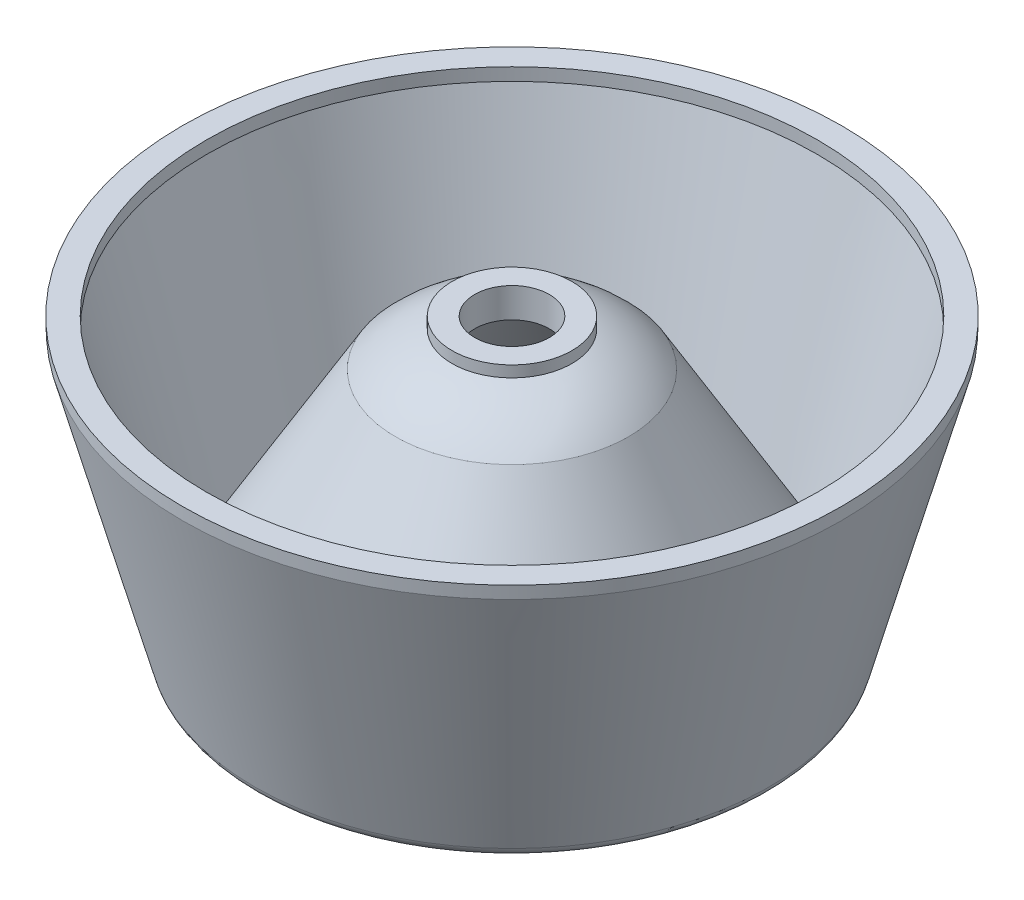
ISO-10303-21;
HEADER;
FILE_DESCRIPTION(('STEP AP214'),'2;1');
FILE_NAME('part.step','',(''),(''),'','','');
FILE_SCHEMA(('AUTOMOTIVE_DESIGN { 1 0 10303 214 1 1 1 1 }'));
ENDSEC;
DATA;
#1=APPLICATION_CONTEXT('core data for automotive mechanical design processes');
#2=APPLICATION_PROTOCOL_DEFINITION('international standard','automotive_design',2000,#1);
#3=PRODUCT_CONTEXT('',#1,'mechanical');
#4=PRODUCT('Part','Part','',(#3));
#5=PRODUCT_RELATED_PRODUCT_CATEGORY('part','',(#4));
#6=PRODUCT_DEFINITION_FORMATION('','',#4);
#7=PRODUCT_DEFINITION_CONTEXT('part definition',#1,'design');
#8=PRODUCT_DEFINITION('design','',#6,#7);
#9=PRODUCT_DEFINITION_SHAPE('','',#8);
#10=(LENGTH_UNIT() NAMED_UNIT(*) SI_UNIT(.MILLI.,.METRE.));
#11=(NAMED_UNIT(*) PLANE_ANGLE_UNIT() SI_UNIT($,.RADIAN.));
#12=(NAMED_UNIT(*) SI_UNIT($,.STERADIAN.) SOLID_ANGLE_UNIT());
#13=UNCERTAINTY_MEASURE_WITH_UNIT(LENGTH_MEASURE(1.E-05),#10,'distance_accuracy_value','');
#14=(GEOMETRIC_REPRESENTATION_CONTEXT(3) GLOBAL_UNCERTAINTY_ASSIGNED_CONTEXT((#13)) GLOBAL_UNIT_ASSIGNED_CONTEXT((#10,
#11,#12)) REPRESENTATION_CONTEXT('',''));
#15=CARTESIAN_POINT('',(0.,0.,0.));
#16=DIRECTION('',(0.,0.,1.));
#17=DIRECTION('',(1.,0.,0.));
#18=AXIS2_PLACEMENT_3D('',#15,#16,#17);
#19=CARTESIAN_POINT('',(0.,37.5,0.));
#20=DIRECTION('',(0.,1.,0.));
#21=DIRECTION('',(-0.00319420156689542,0.,0.999994898525163));
#22=AXIS2_PLACEMENT_3D('',#19,#20,#21);
#23=PLANE('',#22);
#24=CARTESIAN_POINT('',(0.,37.5,0.));
#25=DIRECTION('',(0.,1.,0.));
#26=DIRECTION('',(0.,0.,1.));
#27=AXIS2_PLACEMENT_3D('',#24,#25,#26);
#28=CIRCLE('',#27,71.2513108531376);
#29=CARTESIAN_POINT('',(0.,37.5,71.2513108531377));
#30=VERTEX_POINT('',#29);
#31=EDGE_CURVE('E37',#30,#30,#28,.T.);
#32=ORIENTED_EDGE('',*,*,#31,.T.);
#33=EDGE_LOOP('',(#32));
#34=FACE_BOUND('',#33,.T.);
#35=CARTESIAN_POINT('',(0.,37.5000000000001,0.));
#36=DIRECTION('',(0.,-1.,0.));
#37=DIRECTION('',(0.,0.,-1.));
#38=AXIS2_PLACEMENT_3D('',#35,#36,#37);
#39=CIRCLE('',#38,65.9862345365824);
#40=CARTESIAN_POINT('',(0.,37.5000000000001,-65.9862345365824));
#41=VERTEX_POINT('',#40);
#42=EDGE_CURVE('E220',#41,#41,#39,.T.);
#43=ORIENTED_EDGE('',*,*,#42,.T.);
#44=EDGE_LOOP('',(#43));
#45=FACE_BOUND('',#44,.T.);
#46=ADVANCED_FACE('F34',(#34,#45),#23,.T.);
#47=CARTESIAN_POINT('',(0.,37.5,0.));
#48=DIRECTION('',(0.,1.,0.));
#49=DIRECTION('',(0.,0.,1.));
#50=AXIS2_PLACEMENT_3D('',#47,#48,#49);
#51=CIRCLE('',#50,8.07840908288413);
#52=CARTESIAN_POINT('',(0.,37.5,8.07840908288415));
#53=VERTEX_POINT('',#52);
#54=EDGE_CURVE('E124',#53,#53,#51,.T.);
#55=ORIENTED_EDGE('',*,*,#54,.F.);
#56=EDGE_LOOP('',(#55));
#57=FACE_BOUND('',#56,.T.);
#58=CARTESIAN_POINT('',(0.,37.5,0.));
#59=DIRECTION('',(0.,-1.,0.));
#60=DIRECTION('',(0.,0.,-1.));
#61=AXIS2_PLACEMENT_3D('',#58,#59,#60);
#62=CIRCLE('',#61,12.9537179563936);
#63=CARTESIAN_POINT('',(0.,37.5000000000001,-12.9537179563936));
#64=VERTEX_POINT('',#63);
#65=EDGE_CURVE('E218',#64,#64,#62,.T.);
#66=ORIENTED_EDGE('',*,*,#65,.F.);
#67=EDGE_LOOP('',(#66));
#68=FACE_BOUND('',#67,.T.);
#69=ADVANCED_FACE('F212',(#57,#68),#23,.T.);
#70=CARTESIAN_POINT('',(0.,34.7675604909933,0.));
#71=DIRECTION('',(0.,1.,0.));
#72=DIRECTION('',(0.,0.,1.));
#73=AXIS2_PLACEMENT_3D('',#70,#71,#72);
#74=CONICAL_SURFACE('',#73,71.1662591192297,0.0311166199937539);
#75=ORIENTED_EDGE('',*,*,#31,.F.);
#76=EDGE_LOOP('',(#75));
#77=FACE_BOUND('',#76,.T.);
#78=CARTESIAN_POINT('',(0.,34.7675604909933,0.));
#79=DIRECTION('',(0.,1.,0.));
#80=DIRECTION('',(0.,0.,1.));
#81=AXIS2_PLACEMENT_3D('',#78,#79,#80);
#82=CIRCLE('',#81,71.1662591192297);
#83=CARTESIAN_POINT('',(0.,34.7675604909932,71.1662591192298));
#84=VERTEX_POINT('',#83);
#85=EDGE_CURVE('E166',#84,#84,#82,.T.);
#86=ORIENTED_EDGE('',*,*,#85,.T.);
#87=EDGE_LOOP('',(#86));
#88=FACE_BOUND('',#87,.T.);
#89=ADVANCED_FACE('F215',(#77,#88),#74,.T.);
#90=CARTESIAN_POINT('',(0.,-22.8783157825729,0.));
#91=DIRECTION('',(0.,1.,0.));
#92=DIRECTION('',(0.,0.,1.));
#93=AXIS2_PLACEMENT_3D('',#90,#91,#92);
#94=CONICAL_SURFACE('',#93,55.5585716287928,0.264411817054796);
#95=ORIENTED_EDGE('',*,*,#85,.F.);
#96=EDGE_LOOP('',(#95));
#97=FACE_BOUND('',#96,.T.);
#98=CARTESIAN_POINT('',(0.,-22.8783157825729,0.));
#99=DIRECTION('',(0.,1.,0.));
#100=DIRECTION('',(0.,0.,1.));
#101=AXIS2_PLACEMENT_3D('',#98,#99,#100);
#102=CIRCLE('',#101,55.5585716287928);
#103=CARTESIAN_POINT('',(0.,-22.878315782573,55.5585716287928));
#104=VERTEX_POINT('',#103);
#105=EDGE_CURVE('E169',#104,#104,#102,.T.);
#106=ORIENTED_EDGE('',*,*,#105,.T.);
#107=EDGE_LOOP('',(#106));
#108=FACE_BOUND('',#107,.T.);
#109=ADVANCED_FACE('F315',(#97,#108),#94,.T.);
#110=CARTESIAN_POINT('',(0.,-22.0942910667897,0.));
#111=DIRECTION('',(0.,1.,0.));
#112=DIRECTION('',(0.,0.,1.));
#113=AXIS2_PLACEMENT_3D('',#110,#111,#112);
#114=TOROIDAL_SURFACE('',#113,52.6628324753052,3.00000000000001);
#115=ORIENTED_EDGE('',*,*,#105,.F.);
#116=EDGE_LOOP('',(#115));
#117=FACE_BOUND('',#116,.T.);
#118=CARTESIAN_POINT('',(0.,-23.6066026757682,0.));
#119=DIRECTION('',(0.,1.,0.));
#120=DIRECTION('',(0.,0.,1.));
#121=AXIS2_PLACEMENT_3D('',#118,#119,#120);
#122=CIRCLE('',#121,50.0719033760536);
#123=CARTESIAN_POINT('',(0.,-23.6066026757683,50.0719033760536));
#124=VERTEX_POINT('',#123);
#125=EDGE_CURVE('E172',#124,#124,#122,.T.);
#126=ORIENTED_EDGE('',*,*,#125,.T.);
#127=EDGE_LOOP('',(#126));
#128=FACE_BOUND('',#127,.T.);
#129=ADVANCED_FACE('F318',(#117,#128),#114,.T.);
#130=CARTESIAN_POINT('',(0.,19.7175239632816,0.));
#131=DIRECTION('',(0.,-1.,0.));
#132=DIRECTION('',(0.,0.,-1.));
#133=AXIS2_PLACEMENT_3D('',#130,#131,#132);
#134=CONICAL_SURFACE('',#133,24.7838398454789,0.52834403413605);
#135=CARTESIAN_POINT('',(0.,-8.16513837251757,-13.9887140210881));
#136=DIRECTION('',(0.,0.863643033083877,-0.5041038696595));
#137=DIRECTION('',(0.,-0.5041038696595,-0.863643033083877));
#138=AXIS2_PLACEMENT_3D('',#135,#136,#137);
#139=ELLIPSE('',#138,47.5414040016155,38.6023461770421);
#140=CARTESIAN_POINT('',(7.5,15.3439843225376,26.2876878308013));
#141=VERTEX_POINT('',#140);
#142=CARTESIAN_POINT('',(-7.5,15.3439843225376,26.2876878308013));
#143=VERTEX_POINT('',#142);
#144=EDGE_CURVE('E128',#141,#143,#139,.F.);
#145=ORIENTED_EDGE('',*,*,#144,.T.);
#146=CARTESIAN_POINT('',(-7.50000000000001,40.0566706355563,10.5104434704213));
#147=CARTESIAN_POINT('',(-7.50000000000001,39.7655766617726,10.7191566056887));
#148=CARTESIAN_POINT('',(-7.50000000000001,39.4735114007291,10.9265084335069));
#149=CARTESIAN_POINT('',(-7.50000000000001,38.8876987082595,11.3388117295738));
#150=CARTESIAN_POINT('',(-7.50000000000001,38.59395130737,11.5437632411923));
#151=CARTESIAN_POINT('',(-7.50000000000001,38.0050451635706,11.9515811630868));
#152=CARTESIAN_POINT('',(-7.50000000000001,37.7098865226982,12.1544477208692));
#153=CARTESIAN_POINT('',(-7.50000000000001,37.1183277239239,12.5583646793533));
#154=CARTESIAN_POINT('',(-7.50000000000001,36.8219275595669,12.7594150705947));
#155=CARTESIAN_POINT('',(-7.50000000000001,35.9312357854119,13.3600966382183));
#156=CARTESIAN_POINT('',(-7.50000000000001,35.3353336650756,13.757340490684));
#157=CARTESIAN_POINT('',(-7.50000000000001,34.1402138530294,14.5468259516208));
#158=CARTESIAN_POINT('',(-7.50000000000001,33.5409960904165,14.9390674525221));
#159=CARTESIAN_POINT('',(-7.50000000000001,32.3401383714061,15.7193974090499));
#160=CARTESIAN_POINT('',(-7.50000000000001,31.7384992553008,16.1074871588101));
#161=CARTESIAN_POINT('',(-7.50000000000001,30.5331218234223,16.8803797945363));
#162=CARTESIAN_POINT('',(-7.50000000000001,29.9293835236649,17.2651827055023));
#163=CARTESIAN_POINT('',(-7.50000000000001,28.7201472535547,18.0320972410571));
#164=CARTESIAN_POINT('',(-7.50000000000001,28.1146491739927,18.414208693353));
#165=CARTESIAN_POINT('',(-7.50000000000001,26.902222535717,19.1761561061038));
#166=CARTESIAN_POINT('',(-7.5,26.2952939748241,19.555992063089));
#167=CARTESIAN_POINT('',(-7.5,24.5143235361577,20.6666823350602));
#168=CARTESIAN_POINT('',(-7.5,23.3386520881877,21.3949236650343));
#169=CARTESIAN_POINT('',(-7.5,20.9840560634099,22.8461263809627));
#170=CARTESIAN_POINT('',(-7.5,19.8051314790932,23.5690877547157));
#171=CARTESIAN_POINT('',(-7.5,17.4448371506546,25.0109565797027));
#172=CARTESIAN_POINT('',(-7.5,16.263467452458,25.72986410615));
#173=CARTESIAN_POINT('',(-7.5,13.8988137658005,27.1645240306566));
#174=CARTESIAN_POINT('',(-7.5,12.7155297760589,27.8802764266039));
#175=CARTESIAN_POINT('',(-7.5,10.3471016894525,29.309475992974));
#176=CARTESIAN_POINT('',(-7.5,9.16195715185793,30.0229224328013));
#177=CARTESIAN_POINT('',(-7.5,6.79044297474455,31.4477761399253));
#178=CARTESIAN_POINT('',(-7.5,5.60407333498858,32.1591834068271));
#179=CARTESIAN_POINT('',(-7.5,2.0434695314973,34.2909171250113));
#180=CARTESIAN_POINT('',(-7.5,-0.332255618588415,35.7087531452764));
#181=CARTESIAN_POINT('',(-7.5,-4.51280405870445,38.1981999125627));
#182=CARTESIAN_POINT('',(-7.5,-6.31704351647453,39.2707919899745));
#183=CARTESIAN_POINT('',(-7.5,-9.92677175904228,41.4138724336156));
#184=CARTESIAN_POINT('',(-7.5,-11.7322605440315,42.4843607995223));
#185=CARTESIAN_POINT('',(-7.49999999999999,-17.1501973576237,45.6933403044326));
#186=CARTESIAN_POINT('',(-7.49999999999999,-20.7641169781774,47.8293465246936));
#187=CARTESIAN_POINT('',(-7.49999999999999,-27.992542682349,52.0957954534047));
#188=CARTESIAN_POINT('',(-7.49999999999999,-31.6070473362345,54.226240585441));
#189=CARTESIAN_POINT('',(-7.49999999999999,-37.0301646797427,57.4195904501202));
#190=CARTESIAN_POINT('',(-7.49999999999999,-38.8380956388334,58.4836531890051));
#191=CARTESIAN_POINT('',(-7.49999999999999,-42.4543475322118,60.6111153497434));
#192=CARTESIAN_POINT('',(-7.49999999999999,-44.2626684664567,61.6745147716696));
#193=CARTESIAN_POINT('',(-7.49999999999999,-46.0711523317887,62.7376369936534));
#194=B_SPLINE_CURVE_WITH_KNOTS('',3,(#146,#147,#148,#149,#150,#151,#152,#153,#154,#155,#156,
#157,#158,#159,#160,#161,#162,#163,#164,#165,#166,#167,#168,#169,#170,#171,#172,#173,#174,#175,
#176,#177,#178,#179,#180,#181,#182,#183,#184,#185,#186,#187,#188,#189,#190,#191,#192,#193),
.UNSPECIFIED.,.F.,.F.,(4,2,2,2,2,2,2,2,2,2,2,2,2,2,2,2,2,2,2,2,2,2,2,4),(0.,1.07454705731892,
2.14907466928079,3.22352572980844,4.29798238376902,6.44646112025147,8.59498597962802,
10.742820378726,12.8906384267249,15.038592739387,17.1865503263568,21.3353657569929,
25.4841907718652,29.6329385562692,33.7816891174998,37.931645691019,42.0816030679257,
50.3815314737758,56.6784822099514,62.9754339115513,75.5693333588582,88.1562676949951,
94.4497240815708,100.743179777603),.UNSPECIFIED.);
#195=CARTESIAN_POINT('',(-7.49999999999999,-19.0050952532553,46.7887340507071));
#196=VERTEX_POINT('',#195);
#197=EDGE_CURVE('E130',#143,#196,#194,.T.);
#198=ORIENTED_EDGE('',*,*,#197,.T.);
#199=CARTESIAN_POINT('',(0.,-60.5626749685241,-24.4087241579802));
#200=DIRECTION('',(0.,-0.863643033083877,0.5041038696595));
#201=DIRECTION('',(0.,-0.5041038696595,-0.863643033083877));
#202=AXIS2_PLACEMENT_3D('',#199,#200,#201);
#203=ELLIPSE('',#202,82.9543741196778,67.3567290221141);
#204=CARTESIAN_POINT('',(7.50000000000001,-19.0050952532553,46.7887340507071));
#205=VERTEX_POINT('',#204);
#206=EDGE_CURVE('E241',#196,#205,#203,.F.);
#207=ORIENTED_EDGE('',*,*,#206,.T.);
#208=CARTESIAN_POINT('',(7.50000000000001,-46.0711523317887,62.7376369936534));
#209=CARTESIAN_POINT('',(7.50000000000001,-44.2620113029933,61.6741298239998));
#210=CARTESIAN_POINT('',(7.50000000000001,-42.4530342657251,60.6103437552531));
#211=CARTESIAN_POINT('',(7.50000000000001,-38.8354708611624,58.4821080073729));
#212=CARTESIAN_POINT('',(7.50000000000001,-37.0268844938271,57.4176583283088));
#213=CARTESIAN_POINT('',(7.50000000000001,-31.6019252125617,54.2232256923123));
#214=CARTESIAN_POINT('',(7.50000000000001,-27.9862317052162,52.0920883698607));
#215=CARTESIAN_POINT('',(7.50000000000001,-22.5648930292407,48.8922134072252));
#216=CARTESIAN_POINT('',(7.50000000000001,-20.7582697625525,47.8251328777192));
#217=CARTESIAN_POINT('',(7.50000000000001,-17.1458254569408,45.6896168905014));
#218=CARTESIAN_POINT('',(7.50000000000001,-15.3400044175686,44.6211814335487));
#219=CARTESIAN_POINT('',(7.50000000000001,-11.7292928290917,42.4826062046166));
#220=CARTESIAN_POINT('',(7.50000000000001,-9.92440231194013,41.4124663786801));
#221=CARTESIAN_POINT('',(7.50000000000001,-6.3158611622351,39.2700893541151));
#222=CARTESIAN_POINT('',(7.50000000000001,-4.51221053227013,38.1978521511258));
#223=CARTESIAN_POINT('',(7.50000000000001,-0.906040023102871,36.050426498997));
#224=CARTESIAN_POINT('',(7.50000000000001,0.896479447619462,34.9752373636693));
#225=CARTESIAN_POINT('',(7.5,4.49941358845735,32.8213667414914));
#226=CARTESIAN_POINT('',(7.5,6.29982827364613,31.7426852798622));
#227=CARTESIAN_POINT('',(7.5,9.8976891942927,29.5807315782929));
#228=CARTESIAN_POINT('',(7.5,11.6951356738487,28.4974597449621));
#229=CARTESIAN_POINT('',(7.5,14.3883672498062,26.8676417882717));
#230=CARTESIAN_POINT('',(7.5,15.2856335449511,26.3235433691663));
#231=CARTESIAN_POINT('',(7.5,17.0789713496087,25.2333814830119));
#232=CARTESIAN_POINT('',(7.5,17.9750428597733,24.6873180170357));
#233=CARTESIAN_POINT('',(7.5,19.7660023984773,23.5926535709363));
#234=CARTESIAN_POINT('',(7.5,20.6608899941274,23.0440518823064));
#235=CARTESIAN_POINT('',(7.5,22.4488699139707,21.9439364086733));
#236=CARTESIAN_POINT('',(7.5,23.3419622446605,21.3924226342341));
#237=CARTESIAN_POINT('',(7.5,25.1258297464349,20.285808015422));
#238=CARTESIAN_POINT('',(7.5,26.016605087581,19.7307074453642));
#239=CARTESIAN_POINT('',(7.5,27.795288484753,18.6158990550499));
#240=CARTESIAN_POINT('',(7.5,28.6831965008359,18.0561911709938));
#241=CARTESIAN_POINT('',(7.5,30.4555314362659,16.9306226833111));
#242=CARTESIAN_POINT('',(7.5,31.33995706911,16.3647600520551));
#243=CARTESIAN_POINT('',(7.5,33.1036763533669,15.2251422342821));
#244=CARTESIAN_POINT('',(7.5,33.9829702011514,14.651387352626));
#245=CARTESIAN_POINT('',(7.5,35.2966186009912,13.7824960382977));
#246=CARTESIAN_POINT('',(7.5,35.7336779198482,13.4914492964155));
#247=CARTESIAN_POINT('',(7.5,36.6055990008639,12.9060905921452));
#248=CARTESIAN_POINT('',(7.5,37.0404607891853,12.6117786687647));
#249=CARTESIAN_POINT('',(7.5,37.9075626120638,12.0191912261694));
#250=CARTESIAN_POINT('',(7.5,38.3398023017798,11.720915201404));
#251=CARTESIAN_POINT('',(7.5,38.9856609777691,11.2699019736658));
#252=CARTESIAN_POINT('',(7.5,39.200534848863,11.1189611802883));
#253=CARTESIAN_POINT('',(7.5,39.6293385556098,10.8157409204059));
#254=CARTESIAN_POINT('',(7.5,39.8432683830072,10.6634614422292));
#255=CARTESIAN_POINT('',(7.5,40.0566706355563,10.5104434704213));
#256=B_SPLINE_CURVE_WITH_KNOTS('',3,(#208,#209,#210,#211,#212,#213,#214,#215,#216,#217,#218,
#219,#220,#221,#222,#223,#224,#225,#226,#227,#228,#229,#230,#231,#232,#233,#234,#235,#236,#237,
#238,#239,#240,#241,#242,#243,#244,#245,#246,#247,#248,#249,#250,#251,#252,#253,#254,#255),
.UNSPECIFIED.,.F.,.F.,(4,2,2,2,2,2,2,2,2,2,2,2,2,2,2,2,2,2,2,2,2,2,2,4),(0.,6.29574041454673,
12.5914801697312,25.1825406724665,31.4772154715609,37.7718867459695,44.0667614241697,
50.361649204559,56.6581509382567,62.9546073004991,69.2505171268053,72.3985572757143,
75.5465957062368,78.695573419449,81.8445397169775,84.9932679692361,88.1420398969513,
91.2918826290948,94.4416040292237,96.0168896445208,97.5921564608361,99.1676261399107,
99.9553938409752,100.74316841733),.UNSPECIFIED.);
#257=EDGE_CURVE('E233',#205,#141,#256,.T.);
#258=ORIENTED_EDGE('',*,*,#257,.T.);
#259=EDGE_LOOP('',(#145,#198,#207,#258));
#260=FACE_BOUND('',#259,.T.);
#261=CARTESIAN_POINT('',(0.,-8.16513837251757,13.9887140210881));
#262=DIRECTION('',(0.,0.863643033083876,0.504103869659501));
#263=DIRECTION('',(0.,-0.504103869659501,0.863643033083876));
#264=AXIS2_PLACEMENT_3D('',#261,#262,#263);
#265=ELLIPSE('',#264,47.5414040016155,38.6023461770421);
#266=CARTESIAN_POINT('',(-7.5,15.3439843225377,-26.2876878308013));
#267=VERTEX_POINT('',#266);
#268=CARTESIAN_POINT('',(7.5,15.3439843225377,-26.2876878308013));
#269=VERTEX_POINT('',#268);
#270=EDGE_CURVE('E164',#267,#269,#265,.F.);
#271=ORIENTED_EDGE('',*,*,#270,.T.);
#272=CARTESIAN_POINT('',(7.50000000000001,36.514463840228,-12.9667677122093));
#273=CARTESIAN_POINT('',(7.50000000000001,36.1701854115528,-13.198901376583));
#274=CARTESIAN_POINT('',(7.50000000000001,35.8251964352769,-13.4299779040882));
#275=CARTESIAN_POINT('',(7.50000000000001,35.1339751513132,-13.8902585615131));
#276=CARTESIAN_POINT('',(7.50000000000001,34.7877428531498,-14.1194627057325));
#277=CARTESIAN_POINT('',(7.50000000000001,34.0942182220762,-14.5762368999491));
#278=CARTESIAN_POINT('',(7.50000000000001,33.7469259225215,-14.8038070006255));
#279=CARTESIAN_POINT('',(7.50000000000001,33.0514045646832,-15.2575121997333));
#280=CARTESIAN_POINT('',(7.50000000000001,32.7031755043447,-15.4836472950131));
#281=CARTESIAN_POINT('',(7.50000000000001,31.6573252546498,-16.1601137124399));
#282=CARTESIAN_POINT('',(7.50000000000001,30.9584769111223,-16.6085482799637));
#283=CARTESIAN_POINT('',(7.50000000000001,29.5582172162175,-17.5014064550555));
#284=CARTESIAN_POINT('',(7.50000000000001,28.8568058408429,-17.9458300249329));
#285=CARTESIAN_POINT('',(7.50000000000001,27.4520438873103,-18.8313598126875));
#286=CARTESIAN_POINT('',(7.50000000000001,26.7486936239612,-19.2724665302136));
#287=CARTESIAN_POINT('',(7.50000000000001,25.3403289125306,-20.1520081673602));
#288=CARTESIAN_POINT('',(7.5,24.6353144699725,-20.5904430958309));
#289=CARTESIAN_POINT('',(7.5,22.518182884786,-21.9024677529962));
#290=CARTESIAN_POINT('',(7.5,21.1040175138028,-22.7727521993502));
#291=CARTESIAN_POINT('',(7.5,18.2994851794771,-24.4901360841103));
#292=CARTESIAN_POINT('',(7.5,16.9091922262672,-25.3373565869008));
#293=CARTESIAN_POINT('',(7.5,14.125875901698,-27.0273026378815));
#294=CARTESIAN_POINT('',(7.5,12.7328525269276,-27.8700281804514));
#295=CARTESIAN_POINT('',(7.5,9.94474519185435,-29.5520379571466));
#296=CARTESIAN_POINT('',(7.5,8.5496612471456,-30.3913222171355));
#297=CARTESIAN_POINT('',(7.5,5.75788137206262,-32.067202767667));
#298=CARTESIAN_POINT('',(7.5,4.36118544260092,-32.9037990597301));
#299=CARTESIAN_POINT('',(7.5,1.56631369309104,-34.5749704591231));
#300=CARTESIAN_POINT('',(7.5,0.168137689748779,-35.409545259833));
#301=CARTESIAN_POINT('',(7.5,-2.62925020397156,-37.0769571869354));
#302=CARTESIAN_POINT('',(7.5,-4.02846209454389,-37.909794313002));
#303=CARTESIAN_POINT('',(7.5,-8.22736173783412,-40.4061837000011));
#304=CARTESIAN_POINT('',(7.5,-11.0283116927821,-42.0676129129488));
#305=CARTESIAN_POINT('',(7.49999999999999,-15.9457011629111,-44.9797675222702));
#306=CARTESIAN_POINT('',(7.49999999999999,-18.0616386828266,-46.231341136563));
#307=CARTESIAN_POINT('',(7.49999999999999,-22.2945639314905,-48.7327090004408));
#308=CARTESIAN_POINT('',(7.49999999999999,-24.4115516597721,-49.9825032508159));
#309=CARTESIAN_POINT('',(7.49999999999999,-30.7637568187319,-53.729783340092));
#310=CARTESIAN_POINT('',(7.49999999999999,-35.0002149675831,-56.2251657739972));
#311=CARTESIAN_POINT('',(7.49999999999999,-43.4741539065799,-61.2115294601345));
#312=CARTESIAN_POINT('',(7.49999999999999,-47.711634096574,-63.7025117326608));
#313=CARTESIAN_POINT('',(7.49999999999999,-54.0690071009994,-67.4370170895008));
#314=CARTESIAN_POINT('',(7.49999999999999,-56.188322370808,-68.681523504727));
#315=CARTESIAN_POINT('',(7.49999999999999,-60.4272836288632,-71.1699729567704));
#316=CARTESIAN_POINT('',(7.49999999999998,-62.5469296171082,-72.4139159935905));
#317=CARTESIAN_POINT('',(7.49999999999998,-64.6667138199012,-73.6576234341094));
#318=B_SPLINE_CURVE_WITH_KNOTS('',3,(#272,#273,#274,#275,#276,#277,#278,#279,#280,#281,#282,
#283,#284,#285,#286,#287,#288,#289,#290,#291,#292,#293,#294,#295,#296,#297,#298,#299,#300,#301,
#302,#303,#304,#305,#306,#307,#308,#309,#310,#311,#312,#313,#314,#315,#316,#317),.UNSPECIFIED.,
.F.,.F.,(4,2,2,2,2,2,2,2,2,2,2,2,2,2,2,2,2,2,2,2,2,2,4),(0.,1.24567711316934,2.4913447041401,
3.73697349300169,4.98260501663593,7.47363801628829,9.96469439936311,12.4553676950206,
14.946032735852,19.9275046439698,24.8117834292804,29.6960683202439,34.5803164350571,
39.4645617863055,44.3495066281484,49.2344523862877,59.0043500852961,66.3794868230841,
73.754620285679,88.5048915888685,103.251112981384,110.624215435309,117.997317853016),.UNSPECIFIED.);
#319=CARTESIAN_POINT('',(7.49999999999999,-19.0050952532552,-46.7887340507071));
#320=VERTEX_POINT('',#319);
#321=EDGE_CURVE('E111',#269,#320,#318,.T.);
#322=ORIENTED_EDGE('',*,*,#321,.T.);
#323=CARTESIAN_POINT('',(0.,-60.5626749685242,24.4087241579801));
#324=DIRECTION('',(0.,-0.863643033083876,-0.504103869659501));
#325=DIRECTION('',(0.,-0.504103869659501,0.863643033083877));
#326=AXIS2_PLACEMENT_3D('',#323,#324,#325);
#327=ELLIPSE('',#326,82.9543741196779,67.3567290221141);
#328=CARTESIAN_POINT('',(-7.50000000000001,-19.0050952532552,-46.7887340507071));
#329=VERTEX_POINT('',#328);
#330=EDGE_CURVE('E103',#320,#329,#327,.F.);
#331=ORIENTED_EDGE('',*,*,#330,.T.);
#332=CARTESIAN_POINT('',(-7.50000000000002,-64.6667138199012,-73.6576234341094));
#333=CARTESIAN_POINT('',(-7.50000000000002,-62.5465467238296,-72.4136924901275));
#334=CARTESIAN_POINT('',(-7.50000000000001,-60.4265186701304,-71.1695246029863));
#335=CARTESIAN_POINT('',(-7.50000000000001,-56.1867935161091,-68.6806252924279));
#336=CARTESIAN_POINT('',(-7.50000000000001,-54.0670964157722,-67.435893869036));
#337=CARTESIAN_POINT('',(-7.50000000000001,-47.7086494667603,-63.7007601285028));
#338=CARTESIAN_POINT('',(-7.50000000000001,-43.4704750400172,-61.209377906639));
#339=CARTESIAN_POINT('',(-7.50000000000001,-37.1150108142083,-57.469579402304));
#340=CARTESIAN_POINT('',(-7.50000000000001,-34.9968942496445,-56.2225681245074));
#341=CARTESIAN_POINT('',(-7.50000000000001,-30.7613382520715,-53.7273972998025));
#342=CARTESIAN_POINT('',(-7.50000000000001,-28.6438988188836,-52.4792377531975));
#343=CARTESIAN_POINT('',(-7.50000000000001,-24.4098203261325,-49.981485132638));
#344=CARTESIAN_POINT('',(-7.50000000000001,-22.2931812797778,-48.7318920362904));
#345=CARTESIAN_POINT('',(-7.50000000000001,-18.0609479242356,-46.2309328574073));
#346=CARTESIAN_POINT('',(-7.50000000000001,-15.9453536160791,-44.9795667731267));
#347=CARTESIAN_POINT('',(-7.50000000000001,-11.7152351711831,-42.4744146183));
#348=CARTESIAN_POINT('',(-7.50000000000001,-9.60071120444518,-41.2206282606415));
#349=CARTESIAN_POINT('',(-7.50000000000001,-5.37342072740088,-38.7101116277524));
#350=CARTESIAN_POINT('',(-7.50000000000001,-3.26065421114252,-37.4533813625473));
#351=CARTESIAN_POINT('',(-7.5,0.962435551236072,-34.9360236988523));
#352=CARTESIAN_POINT('',(-7.5,3.07275889677547,-33.6753964671932));
#353=CARTESIAN_POINT('',(-7.5,7.29017525661683,-31.1486850999712));
#354=CARTESIAN_POINT('',(-7.5,9.39726823054867,-29.8826008969538));
#355=CARTESIAN_POINT('',(-7.5,12.5544950749119,-27.9774707206607));
#356=CARTESIAN_POINT('',(-7.5,13.6064120230454,-27.3413799660924));
#357=CARTESIAN_POINT('',(-7.5,15.7087707973037,-26.0667682235092));
#358=CARTESIAN_POINT('',(-7.5,16.7592126258341,-25.428247239464));
#359=CARTESIAN_POINT('',(-7.5,18.8582224230872,-24.1482152168802));
#360=CARTESIAN_POINT('',(-7.5,19.9067904571779,-23.5067042855797));
#361=CARTESIAN_POINT('',(-7.5,22.0015968823635,-22.2198723944661));
#362=CARTESIAN_POINT('',(-7.5,23.0478352587854,-21.5745514107488));
#363=CARTESIAN_POINT('',(-7.5,25.1374412021091,-20.2788946566228));
#364=CARTESIAN_POINT('',(-7.5,26.1808082713521,-19.6285580830792));
#365=CARTESIAN_POINT('',(-7.5,28.2634680503601,-18.3214200659572));
#366=CARTESIAN_POINT('',(-7.5,29.3027608310946,-17.6646187356935));
#367=CARTESIAN_POINT('',(-7.5,30.8575296185914,-16.6727348377269));
#368=CARTESIAN_POINT('',(-7.5,31.3751234132031,-16.3409720323391));
#369=CARTESIAN_POINT('',(-7.5,32.4086071716703,-15.6748074813236));
#370=CARTESIAN_POINT('',(-7.5,32.9244971444209,-15.3404057495042));
#371=CARTESIAN_POINT('',(-7.5,33.9542595066737,-14.6684403508268));
#372=CARTESIAN_POINT('',(-7.5,34.4681317765787,-14.3308765004361));
#373=CARTESIAN_POINT('',(-7.5,35.4933334292124,-13.651891141516));
#374=CARTESIAN_POINT('',(-7.5,36.0046627658269,-13.3104695633943));
#375=CARTESIAN_POINT('',(-7.5,36.514463840228,-12.9667677122093));
#376=B_SPLINE_CURVE_WITH_KNOTS('',3,(#332,#333,#334,#335,#336,#337,#338,#339,#340,#341,#342,
#343,#344,#345,#346,#347,#348,#349,#350,#351,#352,#353,#354,#355,#356,#357,#358,#359,#360,#361,
#362,#363,#364,#365,#366,#367,#368,#369,#370,#371,#372,#373,#374,#375),.UNSPECIFIED.,.F.,.F.,(4,
2,2,2,2,2,2,2,2,2,2,2,2,2,2,2,2,2,2,2,2,4),(0.,7.37443240573747,14.7488644797392,
29.4974888849325,36.8712999901873,44.2451091477756,51.6190351015148,58.9929683185535,
66.3678378757232,73.7426823538841,81.1172153672542,88.4918398013258,92.1796912151584,
95.8675366076609,99.5552507335284,103.242988020724,106.931328612409,110.619604669315,
112.463975955086,114.308337596556,116.152806958361,117.997309647201),.UNSPECIFIED.);
#377=EDGE_CURVE('E108',#329,#267,#376,.T.);
#378=ORIENTED_EDGE('',*,*,#377,.T.);
#379=EDGE_LOOP('',(#271,#322,#331,#378));
#380=FACE_BOUND('',#379,.T.);
#381=ORIENTED_EDGE('',*,*,#125,.F.);
#382=EDGE_LOOP('',(#381));
#383=FACE_BOUND('',#382,.T.);
#384=CARTESIAN_POINT('',(0.,19.7175239632816,0.));
#385=DIRECTION('',(0.,1.,0.));
#386=DIRECTION('',(0.,0.,1.));
#387=AXIS2_PLACEMENT_3D('',#384,#385,#386);
#388=CIRCLE('',#387,24.7838398454789);
#389=CARTESIAN_POINT('',(0.,19.7175239632816,24.7838398454789));
#390=VERTEX_POINT('',#389);
#391=EDGE_CURVE('E175',#390,#390,#388,.T.);
#392=ORIENTED_EDGE('',*,*,#391,.T.);
#393=EDGE_LOOP('',(#392));
#394=FACE_BOUND('',#393,.T.);
#395=ADVANCED_FACE('F105',(#260,#380,#383,#394),#134,.F.);
#396=CARTESIAN_POINT('',(0.,7.89657719946323,0.));
#397=DIRECTION('',(0.,1.,0.));
#398=DIRECTION('',(0.,0.,1.));
#399=AXIS2_PLACEMENT_3D('',#396,#397,#398);
#400=DEGENERATE_TOROIDAL_SURFACE('',#399,4.53190580672045,23.4494267457277,.T.);
#401=ORIENTED_EDGE('',*,*,#391,.F.);
#402=EDGE_LOOP('',(#401));
#403=FACE_BOUND('',#402,.T.);
#404=CARTESIAN_POINT('',(0.,31.0762650579184,0.));
#405=DIRECTION('',(0.,1.,0.));
#406=DIRECTION('',(0.,0.,1.));
#407=AXIS2_PLACEMENT_3D('',#404,#405,#406);
#408=CIRCLE('',#407,8.07840908288413);
#409=CARTESIAN_POINT('',(0.,31.0762650579184,8.07840908288415));
#410=VERTEX_POINT('',#409);
#411=EDGE_CURVE('E178',#410,#410,#408,.T.);
#412=ORIENTED_EDGE('',*,*,#411,.T.);
#413=EDGE_LOOP('',(#412));
#414=FACE_BOUND('',#413,.T.);
#415=ADVANCED_FACE('F326',(#403,#414),#400,.F.);
#416=CARTESIAN_POINT('',(0.,0.,0.));
#417=DIRECTION('',(0.,1.,0.));
#418=DIRECTION('',(0.,0.,1.));
#419=AXIS2_PLACEMENT_3D('',#416,#417,#418);
#420=CYLINDRICAL_SURFACE('',#419,8.07840908288413);
#421=ORIENTED_EDGE('',*,*,#411,.F.);
#422=EDGE_LOOP('',(#421));
#423=FACE_BOUND('',#422,.T.);
#424=ORIENTED_EDGE('',*,*,#54,.T.);
#425=EDGE_LOOP('',(#424));
#426=FACE_BOUND('',#425,.T.);
#427=ADVANCED_FACE('F147',(#423,#426),#420,.F.);
#428=CARTESIAN_POINT('',(-7.5,15.296563484083,-26.2064452948492));
#429=DIRECTION('',(-1.,0.,0.));
#430=DIRECTION('',(0.,-1.,0.));
#431=AXIS2_PLACEMENT_3D('',#428,#429,#430);
#432=PLANE('',#431);
#433=ORIENTED_EDGE('',*,*,#377,.F.);
#434=DIRECTION('',(0.,0.504103869659501,-0.863643033083876));
#435=VECTOR('',#434,1.);
#436=CARTESIAN_POINT('',(-7.50000000000001,-19.2491578392721,-46.3706000812292));
#437=LINE('',#436,#435);
#438=CARTESIAN_POINT('',(-7.50000000000001,-19.2491578392721,-46.3706000812292));
#439=VERTEX_POINT('',#438);
#440=EDGE_CURVE('E116',#439,#329,#437,.T.);
#441=ORIENTED_EDGE('',*,*,#440,.F.);
#442=DIRECTION('',(0.,0.863643033083876,0.504103869659501));
#443=VECTOR('',#442,1.);
#444=CARTESIAN_POINT('',(-7.5,15.296563484083,-26.2064452948492));
#445=LINE('',#444,#443);
#446=CARTESIAN_POINT('',(-7.5,15.296563484083,-26.2064452948492));
#447=VERTEX_POINT('',#446);
#448=EDGE_CURVE('E193',#439,#447,#445,.T.);
#449=ORIENTED_EDGE('',*,*,#448,.T.);
#450=DIRECTION('',(0.,0.504103869659501,-0.863643033083876));
#451=VECTOR('',#450,1.);
#452=CARTESIAN_POINT('',(-7.5,15.296563484083,-26.2064452948492));
#453=LINE('',#452,#451);
#454=EDGE_CURVE('E127',#447,#267,#453,.T.);
#455=ORIENTED_EDGE('',*,*,#454,.T.);
#456=EDGE_LOOP('',(#433,#441,#449,#455));
#457=FACE_BOUND('',#456,.T.);
#458=ADVANCED_FACE('F126',(#457),#432,.T.);
#459=CARTESIAN_POINT('',(7.49999999999999,-19.2491578392721,-46.3706000812292));
#460=DIRECTION('',(0.,-0.863643033083876,-0.504103869659501));
#461=DIRECTION('',(0.,0.504103869659501,-0.863643033083877));
#462=AXIS2_PLACEMENT_3D('',#459,#460,#461);
#463=PLANE('',#462);
#464=DIRECTION('',(0.,0.504103869659501,-0.863643033083876));
#465=VECTOR('',#464,1.);
#466=CARTESIAN_POINT('',(7.49999999999999,-19.2491578392721,-46.3706000812292));
#467=LINE('',#466,#465);
#468=CARTESIAN_POINT('',(7.49999999999999,-19.2491578392721,-46.3706000812292));
#469=VERTEX_POINT('',#468);
#470=EDGE_CURVE('E123',#469,#320,#467,.T.);
#471=ORIENTED_EDGE('',*,*,#470,.F.);
#472=DIRECTION('',(-1.,0.,0.));
#473=VECTOR('',#472,1.);
#474=CARTESIAN_POINT('',(7.49999999999999,-19.2491578392721,-46.3706000812292));
#475=LINE('',#474,#473);
#476=EDGE_CURVE('E119',#469,#439,#475,.T.);
#477=ORIENTED_EDGE('',*,*,#476,.T.);
#478=ORIENTED_EDGE('',*,*,#440,.T.);
#479=ORIENTED_EDGE('',*,*,#330,.F.);
#480=EDGE_LOOP('',(#471,#477,#478,#479));
#481=FACE_BOUND('',#480,.T.);
#482=ADVANCED_FACE('F117',(#481),#463,.T.);
#483=CARTESIAN_POINT('',(7.5,15.296563484083,-26.2064452948492));
#484=DIRECTION('',(1.,0.,0.));
#485=DIRECTION('',(0.,1.,0.));
#486=AXIS2_PLACEMENT_3D('',#483,#484,#485);
#487=PLANE('',#486);
#488=ORIENTED_EDGE('',*,*,#321,.F.);
#489=DIRECTION('',(0.,0.504103869659501,-0.863643033083876));
#490=VECTOR('',#489,1.);
#491=CARTESIAN_POINT('',(7.5,15.296563484083,-26.2064452948492));
#492=LINE('',#491,#490);
#493=CARTESIAN_POINT('',(7.5,15.296563484083,-26.2064452948492));
#494=VERTEX_POINT('',#493);
#495=EDGE_CURVE('E182',#494,#269,#492,.T.);
#496=ORIENTED_EDGE('',*,*,#495,.F.);
#497=DIRECTION('',(0.,-0.863643033083876,-0.504103869659501));
#498=VECTOR('',#497,1.);
#499=CARTESIAN_POINT('',(7.5,15.296563484083,-26.2064452948492));
#500=LINE('',#499,#498);
#501=EDGE_CURVE('E187',#494,#469,#500,.T.);
#502=ORIENTED_EDGE('',*,*,#501,.T.);
#503=ORIENTED_EDGE('',*,*,#470,.T.);
#504=EDGE_LOOP('',(#488,#496,#502,#503));
#505=FACE_BOUND('',#504,.T.);
#506=ADVANCED_FACE('F152',(#505),#487,.T.);
#507=CARTESIAN_POINT('',(7.5,15.296563484083,-26.2064452948492));
#508=DIRECTION('',(0.,0.863643033083876,0.504103869659501));
#509=DIRECTION('',(0.,-0.504103869659501,0.863643033083876));
#510=AXIS2_PLACEMENT_3D('',#507,#508,#509);
#511=PLANE('',#510);
#512=ORIENTED_EDGE('',*,*,#454,.F.);
#513=DIRECTION('',(1.,0.,0.));
#514=VECTOR('',#513,1.);
#515=CARTESIAN_POINT('',(7.5,15.296563484083,-26.2064452948492));
#516=LINE('',#515,#514);
#517=EDGE_CURVE('E190',#447,#494,#516,.T.);
#518=ORIENTED_EDGE('',*,*,#517,.T.);
#519=ORIENTED_EDGE('',*,*,#495,.T.);
#520=ORIENTED_EDGE('',*,*,#270,.F.);
#521=EDGE_LOOP('',(#512,#518,#519,#520));
#522=FACE_BOUND('',#521,.T.);
#523=ADVANCED_FACE('F148',(#522),#511,.T.);
#524=CARTESIAN_POINT('',(0.,15.296563484083,-26.2064452948492));
#525=DIRECTION('',(0.,0.5041038696595,-0.863643033083877));
#526=DIRECTION('',(0.,0.863643033083876,0.504103869659501));
#527=AXIS2_PLACEMENT_3D('',#524,#525,#526);
#528=PLANE('',#527);
#529=ORIENTED_EDGE('',*,*,#448,.F.);
#530=ORIENTED_EDGE('',*,*,#476,.F.);
#531=ORIENTED_EDGE('',*,*,#501,.F.);
#532=ORIENTED_EDGE('',*,*,#517,.F.);
#533=EDGE_LOOP('',(#529,#530,#531,#532));
#534=FACE_BOUND('',#533,.T.);
#535=ADVANCED_FACE('F151',(#534),#528,.F.);
#536=CARTESIAN_POINT('',(7.5,15.2965634840829,26.2064452948492));
#537=DIRECTION('',(1.,0.,0.));
#538=DIRECTION('',(0.,1.,0.));
#539=AXIS2_PLACEMENT_3D('',#536,#537,#538);
#540=PLANE('',#539);
#541=ORIENTED_EDGE('',*,*,#257,.F.);
#542=DIRECTION('',(0.,0.5041038696595,0.863643033083877));
#543=VECTOR('',#542,1.);
#544=CARTESIAN_POINT('',(7.50000000000001,-19.2491578392721,46.3706000812292));
#545=LINE('',#544,#543);
#546=CARTESIAN_POINT('',(7.50000000000001,-19.2491578392721,46.3706000812292));
#547=VERTEX_POINT('',#546);
#548=EDGE_CURVE('E195',#547,#205,#545,.T.);
#549=ORIENTED_EDGE('',*,*,#548,.F.);
#550=DIRECTION('',(0.,0.863643033083877,-0.5041038696595));
#551=VECTOR('',#550,1.);
#552=CARTESIAN_POINT('',(7.5,15.2965634840829,26.2064452948492));
#553=LINE('',#552,#551);
#554=CARTESIAN_POINT('',(7.5,15.2965634840829,26.2064452948492));
#555=VERTEX_POINT('',#554);
#556=EDGE_CURVE('E11',#547,#555,#553,.T.);
#557=ORIENTED_EDGE('',*,*,#556,.T.);
#558=DIRECTION('',(0.,0.5041038696595,0.863643033083877));
#559=VECTOR('',#558,1.);
#560=CARTESIAN_POINT('',(7.5,15.2965634840829,26.2064452948492));
#561=LINE('',#560,#559);
#562=EDGE_CURVE('E50',#555,#141,#561,.T.);
#563=ORIENTED_EDGE('',*,*,#562,.T.);
#564=EDGE_LOOP('',(#541,#549,#557,#563));
#565=FACE_BOUND('',#564,.T.);
#566=ADVANCED_FACE('F242',(#565),#540,.T.);
#567=CARTESIAN_POINT('',(-7.49999999999999,-19.2491578392721,46.3706000812292));
#568=DIRECTION('',(0.,-0.863643033083877,0.5041038696595));
#569=DIRECTION('',(0.,-0.5041038696595,-0.863643033083877));
#570=AXIS2_PLACEMENT_3D('',#567,#568,#569);
#571=PLANE('',#570);
#572=DIRECTION('',(0.,0.5041038696595,0.863643033083877));
#573=VECTOR('',#572,1.);
#574=CARTESIAN_POINT('',(-7.49999999999999,-19.2491578392721,46.3706000812292));
#575=LINE('',#574,#573);
#576=CARTESIAN_POINT('',(-7.49999999999999,-19.2491578392721,46.3706000812292));
#577=VERTEX_POINT('',#576);
#578=EDGE_CURVE('E199',#577,#196,#575,.T.);
#579=ORIENTED_EDGE('',*,*,#578,.F.);
#580=DIRECTION('',(1.,0.,0.));
#581=VECTOR('',#580,1.);
#582=CARTESIAN_POINT('',(-7.49999999999999,-19.2491578392721,46.3706000812292));
#583=LINE('',#582,#581);
#584=EDGE_CURVE('E197',#577,#547,#583,.T.);
#585=ORIENTED_EDGE('',*,*,#584,.T.);
#586=ORIENTED_EDGE('',*,*,#548,.T.);
#587=ORIENTED_EDGE('',*,*,#206,.F.);
#588=EDGE_LOOP('',(#579,#585,#586,#587));
#589=FACE_BOUND('',#588,.T.);
#590=ADVANCED_FACE('F246',(#589),#571,.T.);
#591=CARTESIAN_POINT('',(-7.5,15.2965634840829,26.2064452948492));
#592=DIRECTION('',(-1.,0.,0.));
#593=DIRECTION('',(0.,-1.,0.));
#594=AXIS2_PLACEMENT_3D('',#591,#592,#593);
#595=PLANE('',#594);
#596=ORIENTED_EDGE('',*,*,#197,.F.);
#597=DIRECTION('',(0.,0.5041038696595,0.863643033083877));
#598=VECTOR('',#597,1.);
#599=CARTESIAN_POINT('',(-7.5,15.2965634840829,26.2064452948492));
#600=LINE('',#599,#598);
#601=CARTESIAN_POINT('',(-7.5,15.2965634840829,26.2064452948492));
#602=VERTEX_POINT('',#601);
#603=EDGE_CURVE('E58',#602,#143,#600,.T.);
#604=ORIENTED_EDGE('',*,*,#603,.F.);
#605=DIRECTION('',(0.,-0.863643033083877,0.5041038696595));
#606=VECTOR('',#605,1.);
#607=CARTESIAN_POINT('',(-7.5,15.2965634840829,26.2064452948492));
#608=LINE('',#607,#606);
#609=EDGE_CURVE('E206',#602,#577,#608,.T.);
#610=ORIENTED_EDGE('',*,*,#609,.T.);
#611=ORIENTED_EDGE('',*,*,#578,.T.);
#612=EDGE_LOOP('',(#596,#604,#610,#611));
#613=FACE_BOUND('',#612,.T.);
#614=ADVANCED_FACE('F252',(#613),#595,.T.);
#615=CARTESIAN_POINT('',(-7.5,15.2965634840829,26.2064452948492));
#616=DIRECTION('',(0.,0.863643033083877,-0.5041038696595));
#617=DIRECTION('',(0.,0.5041038696595,0.863643033083877));
#618=AXIS2_PLACEMENT_3D('',#615,#616,#617);
#619=PLANE('',#618);
#620=ORIENTED_EDGE('',*,*,#562,.F.);
#621=DIRECTION('',(-1.,0.,0.));
#622=VECTOR('',#621,1.);
#623=CARTESIAN_POINT('',(-7.5,15.2965634840829,26.2064452948492));
#624=LINE('',#623,#622);
#625=EDGE_CURVE('E42',#555,#602,#624,.T.);
#626=ORIENTED_EDGE('',*,*,#625,.T.);
#627=ORIENTED_EDGE('',*,*,#603,.T.);
#628=ORIENTED_EDGE('',*,*,#144,.F.);
#629=EDGE_LOOP('',(#620,#626,#627,#628));
#630=FACE_BOUND('',#629,.T.);
#631=ADVANCED_FACE('F248',(#630),#619,.T.);
#632=CARTESIAN_POINT('',(0.,15.2965634840829,26.2064452948492));
#633=DIRECTION('',(0.,0.504103869659499,0.863643033083877));
#634=DIRECTION('',(0.,0.863643033083877,-0.5041038696595));
#635=AXIS2_PLACEMENT_3D('',#632,#633,#634);
#636=PLANE('',#635);
#637=ORIENTED_EDGE('',*,*,#556,.F.);
#638=ORIENTED_EDGE('',*,*,#584,.F.);
#639=ORIENTED_EDGE('',*,*,#609,.F.);
#640=ORIENTED_EDGE('',*,*,#625,.F.);
#641=EDGE_LOOP('',(#637,#638,#639,#640));
#642=FACE_BOUND('',#641,.T.);
#643=ADVANCED_FACE('F251',(#642),#636,.F.);
#644=CARTESIAN_POINT('',(0.,-17.83951146112,0.));
#645=DIRECTION('',(0.,1.,0.));
#646=DIRECTION('',(0.,0.,1.));
#647=AXIS2_PLACEMENT_3D('',#644,#645,#646);
#648=CONICAL_SURFACE('',#647,51.7428091279896,0.264411817054795);
#649=CARTESIAN_POINT('',(0.,34.7675604909933,0.));
#650=DIRECTION('',(0.,-1.,0.));
#651=DIRECTION('',(0.,0.,-1.));
#652=AXIS2_PLACEMENT_3D('',#649,#650,#651);
#653=CIRCLE('',#652,65.9862345365824);
#654=CARTESIAN_POINT('',(0.,34.7675604909933,-65.9862345365824));
#655=VERTEX_POINT('',#654);
#656=EDGE_CURVE('E224',#655,#655,#653,.T.);
#657=ORIENTED_EDGE('',*,*,#656,.F.);
#658=EDGE_LOOP('',(#657));
#659=FACE_BOUND('',#658,.T.);
#660=CARTESIAN_POINT('',(0.,-17.83951146112,0.));
#661=DIRECTION('',(0.,-1.,0.));
#662=DIRECTION('',(0.,0.,-1.));
#663=AXIS2_PLACEMENT_3D('',#660,#661,#662);
#664=CIRCLE('',#663,51.7428091279896);
#665=CARTESIAN_POINT('',(0.,-17.83951146112,-51.7428091279896));
#666=VERTEX_POINT('',#665);
#667=EDGE_CURVE('E293',#666,#666,#664,.T.);
#668=ORIENTED_EDGE('',*,*,#667,.T.);
#669=EDGE_LOOP('',(#668));
#670=FACE_BOUND('',#669,.T.);
#671=ADVANCED_FACE('F268',(#659,#670),#648,.F.);
#672=CARTESIAN_POINT('',(0.,31.0762650579184,0.));
#673=DIRECTION('',(0.,-1.,0.));
#674=DIRECTION('',(0.,0.,-1.));
#675=AXIS2_PLACEMENT_3D('',#672,#673,#674);
#676=CYLINDRICAL_SURFACE('',#675,65.9862345365824);
#677=ORIENTED_EDGE('',*,*,#42,.F.);
#678=EDGE_LOOP('',(#677));
#679=FACE_BOUND('',#678,.T.);
#680=ORIENTED_EDGE('',*,*,#656,.T.);
#681=EDGE_LOOP('',(#680));
#682=FACE_BOUND('',#681,.T.);
#683=ADVANCED_FACE('F273',(#679,#682),#676,.F.);
#684=CARTESIAN_POINT('',(0.,31.0762650579184,0.));
#685=DIRECTION('',(0.,-1.,0.));
#686=DIRECTION('',(0.,0.,-1.));
#687=AXIS2_PLACEMENT_3D('',#684,#685,#686);
#688=CYLINDRICAL_SURFACE('',#687,12.9537179563936);
#689=CARTESIAN_POINT('',(0.,35.0708842242274,0.));
#690=DIRECTION('',(0.,-1.,0.));
#691=DIRECTION('',(0.,0.,-1.));
#692=AXIS2_PLACEMENT_3D('',#689,#690,#691);
#693=CIRCLE('',#692,12.9537179563936);
#694=CARTESIAN_POINT('',(0.,35.0708842242274,-12.9537179563936));
#695=VERTEX_POINT('',#694);
#696=EDGE_CURVE('E221',#695,#695,#693,.T.);
#697=ORIENTED_EDGE('',*,*,#696,.F.);
#698=EDGE_LOOP('',(#697));
#699=FACE_BOUND('',#698,.T.);
#700=ORIENTED_EDGE('',*,*,#65,.T.);
#701=EDGE_LOOP('',(#700));
#702=FACE_BOUND('',#701,.T.);
#703=ADVANCED_FACE('F287',(#699,#702),#688,.T.);
#704=CARTESIAN_POINT('',(0.,7.89657719946323,0.));
#705=DIRECTION('',(0.,-1.,0.));
#706=DIRECTION('',(0.,0.,-1.));
#707=AXIS2_PLACEMENT_3D('',#704,#705,#706);
#708=DEGENERATE_TOROIDAL_SURFACE('',#707,4.53190580672045,28.4494267457277,.T.);
#709=CARTESIAN_POINT('',(0.,27.4777064955239,0.));
#710=DIRECTION('',(0.,-1.,0.));
#711=DIRECTION('',(0.,0.,-1.));
#712=AXIS2_PLACEMENT_3D('',#709,#710,#711);
#713=CIRCLE('',#712,25.1704439732545);
#714=CARTESIAN_POINT('',(0.,27.477706495524,-25.1704439732545));
#715=VERTEX_POINT('',#714);
#716=EDGE_CURVE('E227',#715,#715,#713,.T.);
#717=ORIENTED_EDGE('',*,*,#716,.F.);
#718=EDGE_LOOP('',(#717));
#719=FACE_BOUND('',#718,.T.);
#720=ORIENTED_EDGE('',*,*,#696,.T.);
#721=EDGE_LOOP('',(#720));
#722=FACE_BOUND('',#721,.T.);
#723=ADVANCED_FACE('F301',(#719,#722),#708,.T.);
#724=CARTESIAN_POINT('',(0.,27.4777064955239,0.));
#725=DIRECTION('',(0.,-1.,0.));
#726=DIRECTION('',(0.,0.,-1.));
#727=AXIS2_PLACEMENT_3D('',#724,#725,#726);
#728=CONICAL_SURFACE('',#727,25.1704439732545,0.530332359661968);
#729=ORIENTED_EDGE('',*,*,#667,.F.);
#730=EDGE_LOOP('',(#729));
#731=FACE_BOUND('',#730,.T.);
#732=ORIENTED_EDGE('',*,*,#716,.T.);
#733=EDGE_LOOP('',(#732));
#734=FACE_BOUND('',#733,.T.);
#735=ADVANCED_FACE('F299',(#731,#734),#728,.T.);
#736=CLOSED_SHELL('',(#46,#69,#89,#109,#129,#395,#415,#427,#458,#482,#506,#523,#535,#566,#590,
#614,#631,#643,#671,#683,#703,#723,#735));
#737=MANIFOLD_SOLID_BREP('B2',#736);
#738=ADVANCED_BREP_SHAPE_REPRESENTATION('',(#18,#737),#14);
#739=SHAPE_DEFINITION_REPRESENTATION(#9,#738);
ENDSEC;
END-ISO-10303-21;
